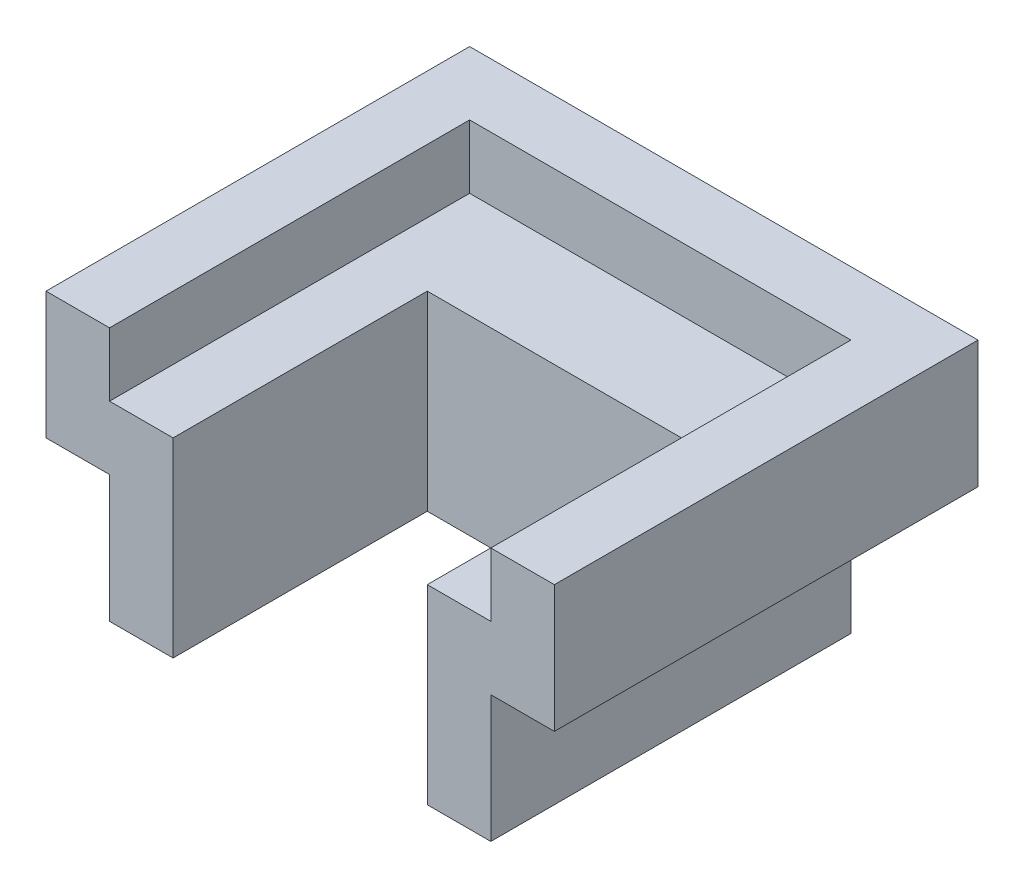
ISO-10303-21;
HEADER;
FILE_DESCRIPTION(('STEP AP214'),'2;1');
FILE_NAME('part.step','',(''),(''),'','','');
FILE_SCHEMA(('AUTOMOTIVE_DESIGN { 1 0 10303 214 1 1 1 1 }'));
ENDSEC;
DATA;
#1=APPLICATION_CONTEXT('core data for automotive mechanical design processes');
#2=APPLICATION_PROTOCOL_DEFINITION('international standard','automotive_design',2000,#1);
#3=PRODUCT_CONTEXT('',#1,'mechanical');
#4=PRODUCT('Part','Part','',(#3));
#5=PRODUCT_RELATED_PRODUCT_CATEGORY('part','',(#4));
#6=PRODUCT_DEFINITION_FORMATION('','',#4);
#7=PRODUCT_DEFINITION_CONTEXT('part definition',#1,'design');
#8=PRODUCT_DEFINITION('design','',#6,#7);
#9=PRODUCT_DEFINITION_SHAPE('','',#8);
#10=(LENGTH_UNIT() NAMED_UNIT(*) SI_UNIT(.MILLI.,.METRE.));
#11=(NAMED_UNIT(*) PLANE_ANGLE_UNIT() SI_UNIT($,.RADIAN.));
#12=(NAMED_UNIT(*) SI_UNIT($,.STERADIAN.) SOLID_ANGLE_UNIT());
#13=UNCERTAINTY_MEASURE_WITH_UNIT(LENGTH_MEASURE(1.E-05),#10,'distance_accuracy_value','');
#14=(GEOMETRIC_REPRESENTATION_CONTEXT(3) GLOBAL_UNCERTAINTY_ASSIGNED_CONTEXT((#13)) GLOBAL_UNIT_ASSIGNED_CONTEXT((#10,
#11,#12)) REPRESENTATION_CONTEXT('',''));
#15=CARTESIAN_POINT('',(0.,0.,0.));
#16=DIRECTION('',(0.,0.,1.));
#17=DIRECTION('',(1.,0.,0.));
#18=AXIS2_PLACEMENT_3D('',#15,#16,#17);
#19=CARTESIAN_POINT('',(0.,9.525,9.52500000000001));
#20=DIRECTION('',(0.,0.,-1.));
#21=DIRECTION('',(-1.,0.,0.));
#22=AXIS2_PLACEMENT_3D('',#19,#20,#21);
#23=PLANE('',#22);
#24=DIRECTION('',(0.,-1.,0.));
#25=VECTOR('',#24,1.);
#26=CARTESIAN_POINT('',(-28.575,9.525,9.52500000000001));
#27=LINE('',#26,#25);
#28=CARTESIAN_POINT('',(-28.575,9.525,9.52500000000001));
#29=VERTEX_POINT('',#28);
#30=CARTESIAN_POINT('',(-28.575,0.,9.52500000000001));
#31=VERTEX_POINT('',#30);
#32=EDGE_CURVE('E242',#29,#31,#27,.T.);
#33=ORIENTED_EDGE('',*,*,#32,.T.);
#34=DIRECTION('',(1.,0.,0.));
#35=VECTOR('',#34,1.);
#36=CARTESIAN_POINT('',(0.,0.,9.52500000000001));
#37=LINE('',#36,#35);
#38=CARTESIAN_POINT('',(28.575,0.,9.52500000000001));
#39=VERTEX_POINT('',#38);
#40=EDGE_CURVE('E48',#31,#39,#37,.T.);
#41=ORIENTED_EDGE('',*,*,#40,.T.);
#42=DIRECTION('',(0.,-1.,0.));
#43=VECTOR('',#42,1.);
#44=CARTESIAN_POINT('',(28.575,9.525,9.52500000000001));
#45=LINE('',#44,#43);
#46=CARTESIAN_POINT('',(28.575,9.525,9.52500000000001));
#47=VERTEX_POINT('',#46);
#48=EDGE_CURVE('E11',#47,#39,#45,.T.);
#49=ORIENTED_EDGE('',*,*,#48,.F.);
#50=DIRECTION('',(1.,0.,0.));
#51=VECTOR('',#50,1.);
#52=CARTESIAN_POINT('',(0.,9.525,9.52500000000001));
#53=LINE('',#52,#51);
#54=EDGE_CURVE('E223',#29,#47,#53,.T.);
#55=ORIENTED_EDGE('',*,*,#54,.F.);
#56=EDGE_LOOP('',(#33,#41,#49,#55));
#57=FACE_BOUND('',#56,.T.);
#58=ADVANCED_FACE('F34',(#57),#23,.F.);
#59=CARTESIAN_POINT('',(28.575,9.525,0.));
#60=DIRECTION('',(1.,0.,0.));
#61=DIRECTION('',(0.,0.,-1.));
#62=AXIS2_PLACEMENT_3D('',#59,#60,#61);
#63=PLANE('',#62);
#64=ORIENTED_EDGE('',*,*,#48,.T.);
#65=DIRECTION('',(0.,0.,1.));
#66=VECTOR('',#65,1.);
#67=CARTESIAN_POINT('',(28.575,0.,0.));
#68=LINE('',#67,#66);
#69=CARTESIAN_POINT('',(28.575,0.,63.5));
#70=VERTEX_POINT('',#69);
#71=EDGE_CURVE('E54',#39,#70,#68,.T.);
#72=ORIENTED_EDGE('',*,*,#71,.T.);
#73=DIRECTION('',(0.,-1.,0.));
#74=VECTOR('',#73,1.);
#75=CARTESIAN_POINT('',(28.575,9.525,63.5));
#76=LINE('',#75,#74);
#77=CARTESIAN_POINT('',(28.575,9.525,63.5));
#78=VERTEX_POINT('',#77);
#79=EDGE_CURVE('E41',#78,#70,#76,.T.);
#80=ORIENTED_EDGE('',*,*,#79,.F.);
#81=DIRECTION('',(0.,0.,1.));
#82=VECTOR('',#81,1.);
#83=CARTESIAN_POINT('',(28.575,9.525,0.));
#84=LINE('',#83,#82);
#85=EDGE_CURVE('E226',#47,#78,#84,.T.);
#86=ORIENTED_EDGE('',*,*,#85,.F.);
#87=EDGE_LOOP('',(#64,#72,#80,#86));
#88=FACE_BOUND('',#87,.T.);
#89=ADVANCED_FACE('F310',(#88),#63,.F.);
#90=CARTESIAN_POINT('',(0.,9.525,63.5));
#91=DIRECTION('',(0.,0.,-1.));
#92=DIRECTION('',(-1.,0.,0.));
#93=AXIS2_PLACEMENT_3D('',#90,#91,#92);
#94=PLANE('',#93);
#95=DIRECTION('',(1.,0.,0.));
#96=VECTOR('',#95,1.);
#97=CARTESIAN_POINT('',(0.,-9.525,63.5));
#98=LINE('',#97,#96);
#99=CARTESIAN_POINT('',(28.575,-9.525,63.5));
#100=VERTEX_POINT('',#99);
#101=CARTESIAN_POINT('',(38.1,-9.525,63.5));
#102=VERTEX_POINT('',#101);
#103=EDGE_CURVE('E246',#100,#102,#98,.T.);
#104=ORIENTED_EDGE('',*,*,#103,.T.);
#105=DIRECTION('',(0.,-1.,0.));
#106=VECTOR('',#105,1.);
#107=CARTESIAN_POINT('',(38.1,9.525,63.5));
#108=LINE('',#107,#106);
#109=CARTESIAN_POINT('',(38.1,9.525,63.5));
#110=VERTEX_POINT('',#109);
#111=EDGE_CURVE('E270',#110,#102,#108,.T.);
#112=ORIENTED_EDGE('',*,*,#111,.F.);
#113=DIRECTION('',(1.,0.,0.));
#114=VECTOR('',#113,1.);
#115=CARTESIAN_POINT('',(0.,9.525,63.5));
#116=LINE('',#115,#114);
#117=EDGE_CURVE('E229',#78,#110,#116,.T.);
#118=ORIENTED_EDGE('',*,*,#117,.F.);
#119=ORIENTED_EDGE('',*,*,#79,.T.);
#120=DIRECTION('',(1.,0.,0.));
#121=VECTOR('',#120,1.);
#122=CARTESIAN_POINT('',(0.,0.,63.5));
#123=LINE('',#122,#121);
#124=CARTESIAN_POINT('',(19.05,0.,63.5));
#125=VERTEX_POINT('',#124);
#126=EDGE_CURVE('E175',#125,#70,#123,.T.);
#127=ORIENTED_EDGE('',*,*,#126,.F.);
#128=DIRECTION('',(0.,1.,0.));
#129=VECTOR('',#128,1.);
#130=CARTESIAN_POINT('',(19.05,-28.575,63.5));
#131=LINE('',#130,#129);
#132=CARTESIAN_POINT('',(19.05,-28.575,63.5));
#133=VERTEX_POINT('',#132);
#134=EDGE_CURVE('E211',#133,#125,#131,.T.);
#135=ORIENTED_EDGE('',*,*,#134,.F.);
#136=DIRECTION('',(1.,0.,0.));
#137=VECTOR('',#136,1.);
#138=CARTESIAN_POINT('',(0.,-28.575,63.5));
#139=LINE('',#138,#137);
#140=CARTESIAN_POINT('',(28.575,-28.575,63.5));
#141=VERTEX_POINT('',#140);
#142=EDGE_CURVE('E169',#133,#141,#139,.T.);
#143=ORIENTED_EDGE('',*,*,#142,.T.);
#144=DIRECTION('',(0.,1.,0.));
#145=VECTOR('',#144,1.);
#146=CARTESIAN_POINT('',(28.575,-28.575,63.5));
#147=LINE('',#146,#145);
#148=EDGE_CURVE('E173',#141,#100,#147,.T.);
#149=ORIENTED_EDGE('',*,*,#148,.T.);
#150=EDGE_LOOP('',(#104,#112,#118,#119,#127,#135,#143,#149));
#151=FACE_BOUND('',#150,.T.);
#152=ADVANCED_FACE('F275',(#151),#94,.F.);
#153=CARTESIAN_POINT('',(38.1,9.525,0.));
#154=DIRECTION('',(-1.,0.,0.));
#155=DIRECTION('',(0.,0.,1.));
#156=AXIS2_PLACEMENT_3D('',#153,#154,#155);
#157=PLANE('',#156);
#158=DIRECTION('',(0.,0.,-1.));
#159=VECTOR('',#158,1.);
#160=CARTESIAN_POINT('',(38.1,-9.525,0.));
#161=LINE('',#160,#159);
#162=CARTESIAN_POINT('',(38.1,-9.525,0.));
#163=VERTEX_POINT('',#162);
#164=EDGE_CURVE('E248',#102,#163,#161,.T.);
#165=ORIENTED_EDGE('',*,*,#164,.T.);
#166=DIRECTION('',(0.,-1.,0.));
#167=VECTOR('',#166,1.);
#168=CARTESIAN_POINT('',(38.1,9.525,0.));
#169=LINE('',#168,#167);
#170=CARTESIAN_POINT('',(38.1,9.525,0.));
#171=VERTEX_POINT('',#170);
#172=EDGE_CURVE('E268',#171,#163,#169,.T.);
#173=ORIENTED_EDGE('',*,*,#172,.F.);
#174=DIRECTION('',(0.,0.,-1.));
#175=VECTOR('',#174,1.);
#176=CARTESIAN_POINT('',(38.1,9.525,0.));
#177=LINE('',#176,#175);
#178=EDGE_CURVE('E231',#110,#171,#177,.T.);
#179=ORIENTED_EDGE('',*,*,#178,.F.);
#180=ORIENTED_EDGE('',*,*,#111,.T.);
#181=EDGE_LOOP('',(#165,#173,#179,#180));
#182=FACE_BOUND('',#181,.T.);
#183=ADVANCED_FACE('F304',(#182),#157,.F.);
#184=CARTESIAN_POINT('',(0.,9.525,0.));
#185=DIRECTION('',(0.,0.,-1.));
#186=DIRECTION('',(-1.,0.,0.));
#187=AXIS2_PLACEMENT_3D('',#184,#185,#186);
#188=PLANE('',#187);
#189=DIRECTION('',(1.,0.,0.));
#190=VECTOR('',#189,1.);
#191=CARTESIAN_POINT('',(0.,-9.525,0.));
#192=LINE('',#191,#190);
#193=CARTESIAN_POINT('',(-38.1,-9.525,0.));
#194=VERTEX_POINT('',#193);
#195=EDGE_CURVE('E251',#194,#163,#192,.T.);
#196=ORIENTED_EDGE('',*,*,#195,.F.);
#197=DIRECTION('',(0.,-1.,0.));
#198=VECTOR('',#197,1.);
#199=CARTESIAN_POINT('',(-38.1,9.525,0.));
#200=LINE('',#199,#198);
#201=CARTESIAN_POINT('',(-38.1,9.525,0.));
#202=VERTEX_POINT('',#201);
#203=EDGE_CURVE('E266',#202,#194,#200,.T.);
#204=ORIENTED_EDGE('',*,*,#203,.F.);
#205=DIRECTION('',(1.,0.,0.));
#206=VECTOR('',#205,1.);
#207=CARTESIAN_POINT('',(0.,9.525,0.));
#208=LINE('',#207,#206);
#209=EDGE_CURVE('E233',#202,#171,#208,.T.);
#210=ORIENTED_EDGE('',*,*,#209,.T.);
#211=ORIENTED_EDGE('',*,*,#172,.T.);
#212=EDGE_LOOP('',(#196,#204,#210,#211));
#213=FACE_BOUND('',#212,.T.);
#214=ADVANCED_FACE('F324',(#213),#188,.T.);
#215=CARTESIAN_POINT('',(-38.1,9.525,0.));
#216=DIRECTION('',(1.,0.,0.));
#217=DIRECTION('',(0.,0.,-1.));
#218=AXIS2_PLACEMENT_3D('',#215,#216,#217);
#219=PLANE('',#218);
#220=DIRECTION('',(0.,0.,1.));
#221=VECTOR('',#220,1.);
#222=CARTESIAN_POINT('',(-38.1,-9.525,0.));
#223=LINE('',#222,#221);
#224=CARTESIAN_POINT('',(-38.1,-9.525,63.5));
#225=VERTEX_POINT('',#224);
#226=EDGE_CURVE('E254',#194,#225,#223,.T.);
#227=ORIENTED_EDGE('',*,*,#226,.T.);
#228=DIRECTION('',(0.,-1.,0.));
#229=VECTOR('',#228,1.);
#230=CARTESIAN_POINT('',(-38.1,9.525,63.5));
#231=LINE('',#230,#229);
#232=CARTESIAN_POINT('',(-38.1,9.525,63.5));
#233=VERTEX_POINT('',#232);
#234=EDGE_CURVE('E263',#233,#225,#231,.T.);
#235=ORIENTED_EDGE('',*,*,#234,.F.);
#236=DIRECTION('',(0.,0.,1.));
#237=VECTOR('',#236,1.);
#238=CARTESIAN_POINT('',(-38.1,9.525,0.));
#239=LINE('',#238,#237);
#240=EDGE_CURVE('E236',#202,#233,#239,.T.);
#241=ORIENTED_EDGE('',*,*,#240,.F.);
#242=ORIENTED_EDGE('',*,*,#203,.T.);
#243=EDGE_LOOP('',(#227,#235,#241,#242));
#244=FACE_BOUND('',#243,.T.);
#245=ADVANCED_FACE('F321',(#244),#219,.F.);
#246=CARTESIAN_POINT('',(0.,9.525,63.5));
#247=DIRECTION('',(0.,0.,-1.));
#248=DIRECTION('',(-1.,0.,0.));
#249=AXIS2_PLACEMENT_3D('',#246,#247,#248);
#250=PLANE('',#249);
#251=DIRECTION('',(1.,0.,0.));
#252=VECTOR('',#251,1.);
#253=CARTESIAN_POINT('',(0.,-9.525,63.5));
#254=LINE('',#253,#252);
#255=CARTESIAN_POINT('',(-28.575,-9.525,63.5));
#256=VERTEX_POINT('',#255);
#257=EDGE_CURVE('E256',#225,#256,#254,.T.);
#258=ORIENTED_EDGE('',*,*,#257,.T.);
#259=DIRECTION('',(0.,1.,0.));
#260=VECTOR('',#259,1.);
#261=CARTESIAN_POINT('',(-28.575,-28.575,63.5));
#262=LINE('',#261,#260);
#263=CARTESIAN_POINT('',(-28.575,-28.575,63.5));
#264=VERTEX_POINT('',#263);
#265=EDGE_CURVE('E219',#264,#256,#262,.T.);
#266=ORIENTED_EDGE('',*,*,#265,.F.);
#267=DIRECTION('',(1.,0.,0.));
#268=VECTOR('',#267,1.);
#269=CARTESIAN_POINT('',(0.,-28.575,63.5));
#270=LINE('',#269,#268);
#271=CARTESIAN_POINT('',(-19.05,-28.575,63.5));
#272=VERTEX_POINT('',#271);
#273=EDGE_CURVE('E182',#264,#272,#270,.T.);
#274=ORIENTED_EDGE('',*,*,#273,.T.);
#275=DIRECTION('',(0.,1.,0.));
#276=VECTOR('',#275,1.);
#277=CARTESIAN_POINT('',(-19.05,-28.575,63.5));
#278=LINE('',#277,#276);
#279=CARTESIAN_POINT('',(-19.05,0.,63.5));
#280=VERTEX_POINT('',#279);
#281=EDGE_CURVE('E217',#272,#280,#278,.T.);
#282=ORIENTED_EDGE('',*,*,#281,.T.);
#283=DIRECTION('',(1.,0.,0.));
#284=VECTOR('',#283,1.);
#285=CARTESIAN_POINT('',(0.,0.,63.5));
#286=LINE('',#285,#284);
#287=CARTESIAN_POINT('',(-28.575,0.,63.5));
#288=VERTEX_POINT('',#287);
#289=EDGE_CURVE('E199',#288,#280,#286,.T.);
#290=ORIENTED_EDGE('',*,*,#289,.F.);
#291=DIRECTION('',(0.,-1.,0.));
#292=VECTOR('',#291,1.);
#293=CARTESIAN_POINT('',(-28.575,9.525,63.5));
#294=LINE('',#293,#292);
#295=CARTESIAN_POINT('',(-28.575,9.525,63.5));
#296=VERTEX_POINT('',#295);
#297=EDGE_CURVE('E261',#296,#288,#294,.T.);
#298=ORIENTED_EDGE('',*,*,#297,.F.);
#299=DIRECTION('',(1.,0.,0.));
#300=VECTOR('',#299,1.);
#301=CARTESIAN_POINT('',(0.,9.525,63.5));
#302=LINE('',#301,#300);
#303=EDGE_CURVE('E238',#233,#296,#302,.T.);
#304=ORIENTED_EDGE('',*,*,#303,.F.);
#305=ORIENTED_EDGE('',*,*,#234,.T.);
#306=EDGE_LOOP('',(#258,#266,#274,#282,#290,#298,#304,#305));
#307=FACE_BOUND('',#306,.T.);
#308=ADVANCED_FACE('F292',(#307),#250,.F.);
#309=CARTESIAN_POINT('',(-28.575,9.525,0.));
#310=DIRECTION('',(-1.,0.,0.));
#311=DIRECTION('',(0.,0.,1.));
#312=AXIS2_PLACEMENT_3D('',#309,#310,#311);
#313=PLANE('',#312);
#314=ORIENTED_EDGE('',*,*,#297,.T.);
#315=DIRECTION('',(0.,0.,-1.));
#316=VECTOR('',#315,1.);
#317=CARTESIAN_POINT('',(-28.575,0.,0.));
#318=LINE('',#317,#316);
#319=EDGE_CURVE('E197',#288,#31,#318,.T.);
#320=ORIENTED_EDGE('',*,*,#319,.T.);
#321=ORIENTED_EDGE('',*,*,#32,.F.);
#322=DIRECTION('',(0.,0.,-1.));
#323=VECTOR('',#322,1.);
#324=CARTESIAN_POINT('',(-28.575,9.525,0.));
#325=LINE('',#324,#323);
#326=EDGE_CURVE('E240',#296,#29,#325,.T.);
#327=ORIENTED_EDGE('',*,*,#326,.F.);
#328=EDGE_LOOP('',(#314,#320,#321,#327));
#329=FACE_BOUND('',#328,.T.);
#330=ADVANCED_FACE('F317',(#329),#313,.F.);
#331=CARTESIAN_POINT('',(0.,9.525,0.));
#332=DIRECTION('',(0.,1.,0.));
#333=DIRECTION('',(0.,0.,1.));
#334=AXIS2_PLACEMENT_3D('',#331,#332,#333);
#335=PLANE('',#334);
#336=ORIENTED_EDGE('',*,*,#54,.T.);
#337=ORIENTED_EDGE('',*,*,#85,.T.);
#338=ORIENTED_EDGE('',*,*,#117,.T.);
#339=ORIENTED_EDGE('',*,*,#178,.T.);
#340=ORIENTED_EDGE('',*,*,#209,.F.);
#341=ORIENTED_EDGE('',*,*,#240,.T.);
#342=ORIENTED_EDGE('',*,*,#303,.T.);
#343=ORIENTED_EDGE('',*,*,#326,.T.);
#344=EDGE_LOOP('',(#336,#337,#338,#339,#340,#341,#342,#343));
#345=FACE_BOUND('',#344,.T.);
#346=ADVANCED_FACE('F308',(#345),#335,.T.);
#347=CARTESIAN_POINT('',(0.,-9.525,0.));
#348=DIRECTION('',(0.,1.,0.));
#349=DIRECTION('',(0.,0.,1.));
#350=AXIS2_PLACEMENT_3D('',#347,#348,#349);
#351=PLANE('',#350);
#352=DIRECTION('',(1.,0.,0.));
#353=VECTOR('',#352,1.);
#354=CARTESIAN_POINT('',(0.,-9.525,9.52500000000001));
#355=LINE('',#354,#353);
#356=CARTESIAN_POINT('',(-28.575,-9.525,9.52500000000001));
#357=VERTEX_POINT('',#356);
#358=CARTESIAN_POINT('',(28.575,-9.525,9.52500000000001));
#359=VERTEX_POINT('',#358);
#360=EDGE_CURVE('E165',#357,#359,#355,.T.);
#361=ORIENTED_EDGE('',*,*,#360,.F.);
#362=DIRECTION('',(0.,0.,-1.));
#363=VECTOR('',#362,1.);
#364=CARTESIAN_POINT('',(-28.575,-9.525,0.));
#365=LINE('',#364,#363);
#366=EDGE_CURVE('E227',#256,#357,#365,.T.);
#367=ORIENTED_EDGE('',*,*,#366,.F.);
#368=ORIENTED_EDGE('',*,*,#257,.F.);
#369=ORIENTED_EDGE('',*,*,#226,.F.);
#370=ORIENTED_EDGE('',*,*,#195,.T.);
#371=ORIENTED_EDGE('',*,*,#164,.F.);
#372=ORIENTED_EDGE('',*,*,#103,.F.);
#373=DIRECTION('',(0.,0.,1.));
#374=VECTOR('',#373,1.);
#375=CARTESIAN_POINT('',(28.575,-9.525,0.));
#376=LINE('',#375,#374);
#377=EDGE_CURVE('E244',#359,#100,#376,.T.);
#378=ORIENTED_EDGE('',*,*,#377,.F.);
#379=EDGE_LOOP('',(#361,#367,#368,#369,#370,#371,#372,#378));
#380=FACE_BOUND('',#379,.T.);
#381=ADVANCED_FACE('F299',(#380),#351,.F.);
#382=CARTESIAN_POINT('',(28.575,-28.575,0.));
#383=DIRECTION('',(-1.,0.,0.));
#384=DIRECTION('',(0.,0.,1.));
#385=AXIS2_PLACEMENT_3D('',#382,#383,#384);
#386=PLANE('',#385);
#387=DIRECTION('',(0.,1.,0.));
#388=VECTOR('',#387,1.);
#389=CARTESIAN_POINT('',(28.575,-28.575,9.52500000000001));
#390=LINE('',#389,#388);
#391=CARTESIAN_POINT('',(28.575,-28.575,9.52500000000001));
#392=VERTEX_POINT('',#391);
#393=EDGE_CURVE('E163',#392,#359,#390,.T.);
#394=ORIENTED_EDGE('',*,*,#393,.T.);
#395=ORIENTED_EDGE('',*,*,#377,.T.);
#396=ORIENTED_EDGE('',*,*,#148,.F.);
#397=DIRECTION('',(0.,0.,1.));
#398=VECTOR('',#397,1.);
#399=CARTESIAN_POINT('',(28.575,-28.575,0.));
#400=LINE('',#399,#398);
#401=EDGE_CURVE('E152',#392,#141,#400,.T.);
#402=ORIENTED_EDGE('',*,*,#401,.F.);
#403=EDGE_LOOP('',(#394,#395,#396,#402));
#404=FACE_BOUND('',#403,.T.);
#405=ADVANCED_FACE('F171',(#404),#386,.F.);
#406=CARTESIAN_POINT('',(-28.575,-28.575,0.));
#407=DIRECTION('',(1.,0.,0.));
#408=DIRECTION('',(0.,0.,-1.));
#409=AXIS2_PLACEMENT_3D('',#406,#407,#408);
#410=PLANE('',#409);
#411=ORIENTED_EDGE('',*,*,#265,.T.);
#412=ORIENTED_EDGE('',*,*,#366,.T.);
#413=DIRECTION('',(0.,1.,0.));
#414=VECTOR('',#413,1.);
#415=CARTESIAN_POINT('',(-28.575,-28.575,9.52500000000001));
#416=LINE('',#415,#414);
#417=CARTESIAN_POINT('',(-28.575,-28.575,9.52500000000001));
#418=VERTEX_POINT('',#417);
#419=EDGE_CURVE('E168',#418,#357,#416,.T.);
#420=ORIENTED_EDGE('',*,*,#419,.F.);
#421=DIRECTION('',(0.,0.,-1.));
#422=VECTOR('',#421,1.);
#423=CARTESIAN_POINT('',(-28.575,-28.575,0.));
#424=LINE('',#423,#422);
#425=EDGE_CURVE('E156',#264,#418,#424,.T.);
#426=ORIENTED_EDGE('',*,*,#425,.F.);
#427=EDGE_LOOP('',(#411,#412,#420,#426));
#428=FACE_BOUND('',#427,.T.);
#429=ADVANCED_FACE('F297',(#428),#410,.F.);
#430=CARTESIAN_POINT('',(0.,-28.575,9.52500000000001));
#431=DIRECTION('',(0.,0.,1.));
#432=DIRECTION('',(1.,0.,0.));
#433=AXIS2_PLACEMENT_3D('',#430,#431,#432);
#434=PLANE('',#433);
#435=ORIENTED_EDGE('',*,*,#419,.T.);
#436=ORIENTED_EDGE('',*,*,#360,.T.);
#437=ORIENTED_EDGE('',*,*,#393,.F.);
#438=DIRECTION('',(1.,0.,0.));
#439=VECTOR('',#438,1.);
#440=CARTESIAN_POINT('',(0.,-28.575,9.52500000000001));
#441=LINE('',#440,#439);
#442=EDGE_CURVE('E147',#418,#392,#441,.T.);
#443=ORIENTED_EDGE('',*,*,#442,.F.);
#444=EDGE_LOOP('',(#435,#436,#437,#443));
#445=FACE_BOUND('',#444,.T.);
#446=ADVANCED_FACE('F164',(#445),#434,.F.);
#447=CARTESIAN_POINT('',(19.05,-28.575,0.));
#448=DIRECTION('',(-1.,0.,0.));
#449=DIRECTION('',(0.,0.,1.));
#450=AXIS2_PLACEMENT_3D('',#447,#448,#449);
#451=PLANE('',#450);
#452=DIRECTION('',(0.,0.,1.));
#453=VECTOR('',#452,1.);
#454=CARTESIAN_POINT('',(19.05,0.,0.));
#455=LINE('',#454,#453);
#456=CARTESIAN_POINT('',(19.05,0.,25.4));
#457=VERTEX_POINT('',#456);
#458=EDGE_CURVE('E178',#457,#125,#455,.T.);
#459=ORIENTED_EDGE('',*,*,#458,.F.);
#460=DIRECTION('',(0.,1.,0.));
#461=VECTOR('',#460,1.);
#462=CARTESIAN_POINT('',(19.05,-28.575,25.4));
#463=LINE('',#462,#461);
#464=CARTESIAN_POINT('',(19.05,-28.575,25.4));
#465=VERTEX_POINT('',#464);
#466=EDGE_CURVE('E213',#465,#457,#463,.T.);
#467=ORIENTED_EDGE('',*,*,#466,.F.);
#468=DIRECTION('',(0.,0.,1.));
#469=VECTOR('',#468,1.);
#470=CARTESIAN_POINT('',(19.05,-28.575,0.));
#471=LINE('',#470,#469);
#472=EDGE_CURVE('E191',#465,#133,#471,.T.);
#473=ORIENTED_EDGE('',*,*,#472,.T.);
#474=ORIENTED_EDGE('',*,*,#134,.T.);
#475=EDGE_LOOP('',(#459,#467,#473,#474));
#476=FACE_BOUND('',#475,.T.);
#477=ADVANCED_FACE('F282',(#476),#451,.T.);
#478=CARTESIAN_POINT('',(0.,-28.575,25.4));
#479=DIRECTION('',(0.,0.,1.));
#480=DIRECTION('',(1.,0.,0.));
#481=AXIS2_PLACEMENT_3D('',#478,#479,#480);
#482=PLANE('',#481);
#483=DIRECTION('',(1.,0.,0.));
#484=VECTOR('',#483,1.);
#485=CARTESIAN_POINT('',(0.,0.,25.4));
#486=LINE('',#485,#484);
#487=CARTESIAN_POINT('',(-19.05,0.,25.4));
#488=VERTEX_POINT('',#487);
#489=EDGE_CURVE('E205',#488,#457,#486,.T.);
#490=ORIENTED_EDGE('',*,*,#489,.F.);
#491=DIRECTION('',(0.,1.,0.));
#492=VECTOR('',#491,1.);
#493=CARTESIAN_POINT('',(-19.05,-28.575,25.4));
#494=LINE('',#493,#492);
#495=CARTESIAN_POINT('',(-19.05,-28.575,25.4));
#496=VERTEX_POINT('',#495);
#497=EDGE_CURVE('E215',#496,#488,#494,.T.);
#498=ORIENTED_EDGE('',*,*,#497,.F.);
#499=DIRECTION('',(1.,0.,0.));
#500=VECTOR('',#499,1.);
#501=CARTESIAN_POINT('',(0.,-28.575,25.4));
#502=LINE('',#501,#500);
#503=EDGE_CURVE('E188',#496,#465,#502,.T.);
#504=ORIENTED_EDGE('',*,*,#503,.T.);
#505=ORIENTED_EDGE('',*,*,#466,.T.);
#506=EDGE_LOOP('',(#490,#498,#504,#505));
#507=FACE_BOUND('',#506,.T.);
#508=ADVANCED_FACE('F287',(#507),#482,.T.);
#509=CARTESIAN_POINT('',(-19.05,-28.575,0.));
#510=DIRECTION('',(1.,0.,0.));
#511=DIRECTION('',(0.,0.,-1.));
#512=AXIS2_PLACEMENT_3D('',#509,#510,#511);
#513=PLANE('',#512);
#514=DIRECTION('',(0.,0.,-1.));
#515=VECTOR('',#514,1.);
#516=CARTESIAN_POINT('',(-19.05,0.,0.));
#517=LINE('',#516,#515);
#518=EDGE_CURVE('E202',#280,#488,#517,.T.);
#519=ORIENTED_EDGE('',*,*,#518,.F.);
#520=ORIENTED_EDGE('',*,*,#281,.F.);
#521=DIRECTION('',(0.,0.,-1.));
#522=VECTOR('',#521,1.);
#523=CARTESIAN_POINT('',(-19.05,-28.575,0.));
#524=LINE('',#523,#522);
#525=EDGE_CURVE('E185',#272,#496,#524,.T.);
#526=ORIENTED_EDGE('',*,*,#525,.T.);
#527=ORIENTED_EDGE('',*,*,#497,.T.);
#528=EDGE_LOOP('',(#519,#520,#526,#527));
#529=FACE_BOUND('',#528,.T.);
#530=ADVANCED_FACE('F290',(#529),#513,.T.);
#531=CARTESIAN_POINT('',(0.,-28.575,0.));
#532=DIRECTION('',(0.,1.,0.));
#533=DIRECTION('',(0.,0.,1.));
#534=AXIS2_PLACEMENT_3D('',#531,#532,#533);
#535=PLANE('',#534);
#536=ORIENTED_EDGE('',*,*,#401,.T.);
#537=ORIENTED_EDGE('',*,*,#142,.F.);
#538=ORIENTED_EDGE('',*,*,#472,.F.);
#539=ORIENTED_EDGE('',*,*,#503,.F.);
#540=ORIENTED_EDGE('',*,*,#525,.F.);
#541=ORIENTED_EDGE('',*,*,#273,.F.);
#542=ORIENTED_EDGE('',*,*,#425,.T.);
#543=ORIENTED_EDGE('',*,*,#442,.T.);
#544=EDGE_LOOP('',(#536,#537,#538,#539,#540,#541,#542,#543));
#545=FACE_BOUND('',#544,.T.);
#546=ADVANCED_FACE('F149',(#545),#535,.F.);
#547=CARTESIAN_POINT('',(0.,0.,0.));
#548=DIRECTION('',(0.,1.,0.));
#549=DIRECTION('',(0.,0.,1.));
#550=AXIS2_PLACEMENT_3D('',#547,#548,#549);
#551=PLANE('',#550);
#552=ORIENTED_EDGE('',*,*,#71,.F.);
#553=ORIENTED_EDGE('',*,*,#40,.F.);
#554=ORIENTED_EDGE('',*,*,#319,.F.);
#555=ORIENTED_EDGE('',*,*,#289,.T.);
#556=ORIENTED_EDGE('',*,*,#518,.T.);
#557=ORIENTED_EDGE('',*,*,#489,.T.);
#558=ORIENTED_EDGE('',*,*,#458,.T.);
#559=ORIENTED_EDGE('',*,*,#126,.T.);
#560=EDGE_LOOP('',(#552,#553,#554,#555,#556,#557,#558,#559));
#561=FACE_BOUND('',#560,.T.);
#562=ADVANCED_FACE('F278',(#561),#551,.T.);
#563=CLOSED_SHELL('',(#58,#89,#152,#183,#214,#245,#308,#330,#346,#381,#405,#429,#446,#477,#508,
#530,#546,#562));
#564=MANIFOLD_SOLID_BREP('B2',#563);
#565=ADVANCED_BREP_SHAPE_REPRESENTATION('',(#18,#564),#14);
#566=SHAPE_DEFINITION_REPRESENTATION(#9,#565);
ENDSEC;
END-ISO-10303-21;
